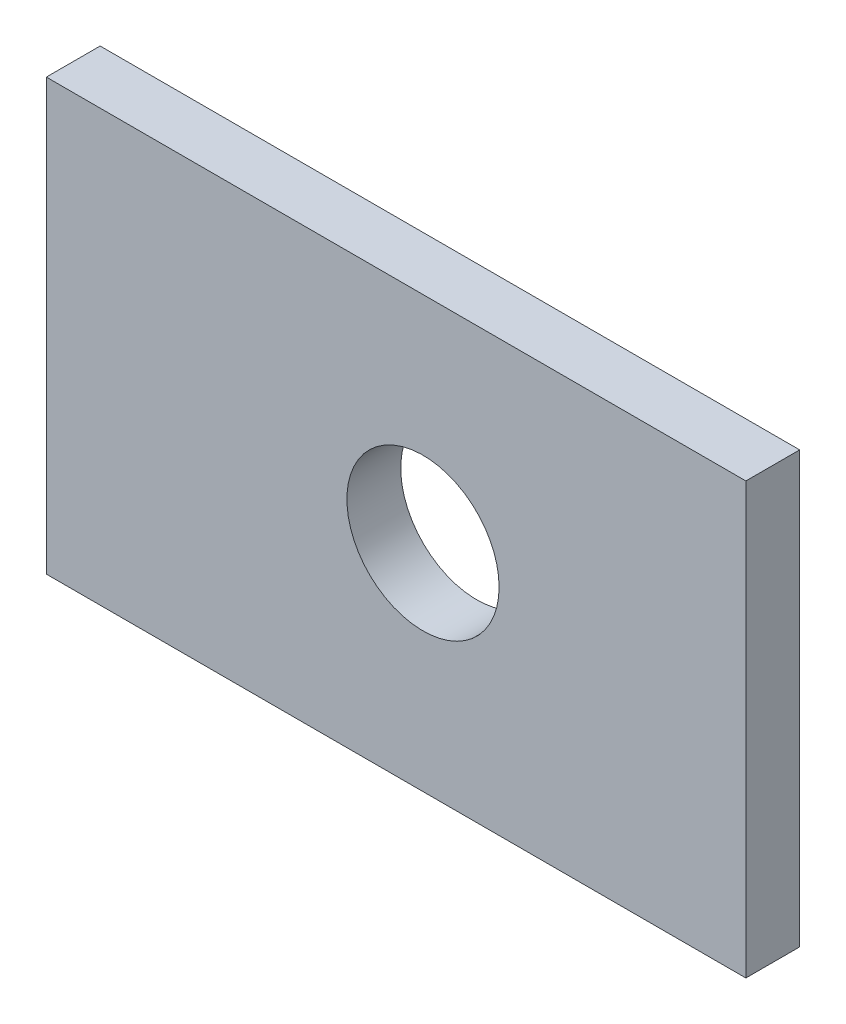
ISO-10303-21;
HEADER;
FILE_DESCRIPTION(('STEP AP214'),'2;1');
FILE_NAME('part.step','',(''),(''),'','','');
FILE_SCHEMA(('AUTOMOTIVE_DESIGN { 1 0 10303 214 1 1 1 1 }'));
ENDSEC;
DATA;
#1=APPLICATION_CONTEXT('core data for automotive mechanical design processes');
#2=APPLICATION_PROTOCOL_DEFINITION('international standard','automotive_design',2000,#1);
#3=PRODUCT_CONTEXT('',#1,'mechanical');
#4=PRODUCT('Part','Part','',(#3));
#5=PRODUCT_RELATED_PRODUCT_CATEGORY('part','',(#4));
#6=PRODUCT_DEFINITION_FORMATION('','',#4);
#7=PRODUCT_DEFINITION_CONTEXT('part definition',#1,'design');
#8=PRODUCT_DEFINITION('design','',#6,#7);
#9=PRODUCT_DEFINITION_SHAPE('','',#8);
#10=(LENGTH_UNIT() NAMED_UNIT(*) SI_UNIT(.MILLI.,.METRE.));
#11=(NAMED_UNIT(*) PLANE_ANGLE_UNIT() SI_UNIT($,.RADIAN.));
#12=(NAMED_UNIT(*) SI_UNIT($,.STERADIAN.) SOLID_ANGLE_UNIT());
#13=UNCERTAINTY_MEASURE_WITH_UNIT(LENGTH_MEASURE(1.E-05),#10,'distance_accuracy_value','');
#14=(GEOMETRIC_REPRESENTATION_CONTEXT(3) GLOBAL_UNCERTAINTY_ASSIGNED_CONTEXT((#13)) GLOBAL_UNIT_ASSIGNED_CONTEXT((#10,
#11,#12)) REPRESENTATION_CONTEXT('',''));
#15=CARTESIAN_POINT('',(0.,0.,0.));
#16=DIRECTION('',(0.,0.,1.));
#17=DIRECTION('',(1.,0.,0.));
#18=AXIS2_PLACEMENT_3D('',#15,#16,#17);
#19=CARTESIAN_POINT('',(0.,0.,10.));
#20=DIRECTION('',(0.,0.,1.));
#21=DIRECTION('',(1.,0.,0.));
#22=AXIS2_PLACEMENT_3D('',#19,#20,#21);
#23=PLANE('',#22);
#24=DIRECTION('',(0.,-1.,0.));
#25=VECTOR('',#24,1.);
#26=CARTESIAN_POINT('',(-50.,30.,10.));
#27=LINE('',#26,#25);
#28=CARTESIAN_POINT('',(-50.,30.,10.));
#29=VERTEX_POINT('',#28);
#30=CARTESIAN_POINT('',(-50.,-50.,10.));
#31=VERTEX_POINT('',#30);
#32=EDGE_CURVE('E84',#29,#31,#27,.T.);
#33=ORIENTED_EDGE('',*,*,#32,.T.);
#34=DIRECTION('',(1.,0.,0.));
#35=VECTOR('',#34,1.);
#36=CARTESIAN_POINT('',(-50.,-50.,10.));
#37=LINE('',#36,#35);
#38=CARTESIAN_POINT('',(80.,-50.,10.));
#39=VERTEX_POINT('',#38);
#40=EDGE_CURVE('E79',#31,#39,#37,.T.);
#41=ORIENTED_EDGE('',*,*,#40,.T.);
#42=DIRECTION('',(0.,1.,0.));
#43=VECTOR('',#42,1.);
#44=CARTESIAN_POINT('',(80.,30.,10.));
#45=LINE('',#44,#43);
#46=CARTESIAN_POINT('',(80.,30.,10.));
#47=VERTEX_POINT('',#46);
#48=EDGE_CURVE('E82',#39,#47,#45,.T.);
#49=ORIENTED_EDGE('',*,*,#48,.T.);
#50=DIRECTION('',(-1.,0.,0.));
#51=VECTOR('',#50,1.);
#52=CARTESIAN_POINT('',(-50.,30.,10.));
#53=LINE('',#52,#51);
#54=EDGE_CURVE('E49',#47,#29,#53,.T.);
#55=ORIENTED_EDGE('',*,*,#54,.T.);
#56=EDGE_LOOP('',(#33,#41,#49,#55));
#57=FACE_BOUND('',#56,.T.);
#58=CARTESIAN_POINT('',(20.,-10.,10.));
#59=DIRECTION('',(0.,0.,1.));
#60=DIRECTION('',(1.,0.,0.));
#61=AXIS2_PLACEMENT_3D('',#58,#59,#60);
#62=CIRCLE('',#61,14.1421356237309);
#63=CARTESIAN_POINT('',(34.1421356237309,-10.,10.));
#64=VERTEX_POINT('',#63);
#65=EDGE_CURVE('E99',#64,#64,#62,.T.);
#66=ORIENTED_EDGE('',*,*,#65,.F.);
#67=EDGE_LOOP('',(#66));
#68=FACE_BOUND('',#67,.T.);
#69=ADVANCED_FACE('F32',(#57,#68),#23,.T.);
#70=CARTESIAN_POINT('',(0.,0.,0.));
#71=DIRECTION('',(0.,0.,1.));
#72=DIRECTION('',(1.,0.,0.));
#73=AXIS2_PLACEMENT_3D('',#70,#71,#72);
#74=PLANE('',#73);
#75=DIRECTION('',(0.,-1.,0.));
#76=VECTOR('',#75,1.);
#77=CARTESIAN_POINT('',(-50.,30.,0.));
#78=LINE('',#77,#76);
#79=CARTESIAN_POINT('',(-50.,30.,0.));
#80=VERTEX_POINT('',#79);
#81=CARTESIAN_POINT('',(-50.,-50.,0.));
#82=VERTEX_POINT('',#81);
#83=EDGE_CURVE('E96',#80,#82,#78,.T.);
#84=ORIENTED_EDGE('',*,*,#83,.F.);
#85=DIRECTION('',(-1.,0.,0.));
#86=VECTOR('',#85,1.);
#87=CARTESIAN_POINT('',(-50.,30.,0.));
#88=LINE('',#87,#86);
#89=CARTESIAN_POINT('',(80.,30.,0.));
#90=VERTEX_POINT('',#89);
#91=EDGE_CURVE('E72',#90,#80,#88,.T.);
#92=ORIENTED_EDGE('',*,*,#91,.F.);
#93=DIRECTION('',(0.,1.,0.));
#94=VECTOR('',#93,1.);
#95=CARTESIAN_POINT('',(80.,30.,0.));
#96=LINE('',#95,#94);
#97=CARTESIAN_POINT('',(80.,-50.,0.));
#98=VERTEX_POINT('',#97);
#99=EDGE_CURVE('E66',#98,#90,#96,.T.);
#100=ORIENTED_EDGE('',*,*,#99,.F.);
#101=DIRECTION('',(1.,0.,0.));
#102=VECTOR('',#101,1.);
#103=CARTESIAN_POINT('',(-50.,-50.,0.));
#104=LINE('',#103,#102);
#105=EDGE_CURVE('E88',#82,#98,#104,.T.);
#106=ORIENTED_EDGE('',*,*,#105,.F.);
#107=EDGE_LOOP('',(#84,#92,#100,#106));
#108=FACE_BOUND('',#107,.T.);
#109=CARTESIAN_POINT('',(20.,-10.,0.));
#110=DIRECTION('',(0.,0.,1.));
#111=DIRECTION('',(1.,0.,0.));
#112=AXIS2_PLACEMENT_3D('',#109,#110,#111);
#113=CIRCLE('',#112,14.1421356237309);
#114=CARTESIAN_POINT('',(34.1421356237309,-10.,0.));
#115=VERTEX_POINT('',#114);
#116=EDGE_CURVE('E111',#115,#115,#113,.T.);
#117=ORIENTED_EDGE('',*,*,#116,.T.);
#118=EDGE_LOOP('',(#117));
#119=FACE_BOUND('',#118,.T.);
#120=ADVANCED_FACE('F107',(#108,#119),#74,.F.);
#121=CARTESIAN_POINT('',(-50.,30.,10.));
#122=DIRECTION('',(1.,0.,0.));
#123=DIRECTION('',(0.,0.,-1.));
#124=AXIS2_PLACEMENT_3D('',#121,#122,#123);
#125=PLANE('',#124);
#126=ORIENTED_EDGE('',*,*,#83,.T.);
#127=DIRECTION('',(0.,0.,-1.));
#128=VECTOR('',#127,1.);
#129=CARTESIAN_POINT('',(-50.,-50.,10.));
#130=LINE('',#129,#128);
#131=EDGE_CURVE('E11',#31,#82,#130,.T.);
#132=ORIENTED_EDGE('',*,*,#131,.F.);
#133=ORIENTED_EDGE('',*,*,#32,.F.);
#134=DIRECTION('',(0.,0.,-1.));
#135=VECTOR('',#134,1.);
#136=CARTESIAN_POINT('',(-50.,30.,10.));
#137=LINE('',#136,#135);
#138=EDGE_CURVE('E92',#29,#80,#137,.T.);
#139=ORIENTED_EDGE('',*,*,#138,.T.);
#140=EDGE_LOOP('',(#126,#132,#133,#139));
#141=FACE_BOUND('',#140,.T.);
#142=ADVANCED_FACE('F34',(#141),#125,.F.);
#143=CARTESIAN_POINT('',(-50.,-50.,10.));
#144=DIRECTION('',(0.,1.,0.));
#145=DIRECTION('',(0.,0.,1.));
#146=AXIS2_PLACEMENT_3D('',#143,#144,#145);
#147=PLANE('',#146);
#148=ORIENTED_EDGE('',*,*,#105,.T.);
#149=DIRECTION('',(0.,0.,-1.));
#150=VECTOR('',#149,1.);
#151=CARTESIAN_POINT('',(80.,-50.,10.));
#152=LINE('',#151,#150);
#153=EDGE_CURVE('E41',#39,#98,#152,.T.);
#154=ORIENTED_EDGE('',*,*,#153,.F.);
#155=ORIENTED_EDGE('',*,*,#40,.F.);
#156=ORIENTED_EDGE('',*,*,#131,.T.);
#157=EDGE_LOOP('',(#148,#154,#155,#156));
#158=FACE_BOUND('',#157,.T.);
#159=ADVANCED_FACE('F87',(#158),#147,.F.);
#160=CARTESIAN_POINT('',(80.,30.,10.));
#161=DIRECTION('',(-1.,0.,0.));
#162=DIRECTION('',(0.,0.,1.));
#163=AXIS2_PLACEMENT_3D('',#160,#161,#162);
#164=PLANE('',#163);
#165=ORIENTED_EDGE('',*,*,#99,.T.);
#166=DIRECTION('',(0.,0.,-1.));
#167=VECTOR('',#166,1.);
#168=CARTESIAN_POINT('',(80.,30.,10.));
#169=LINE('',#168,#167);
#170=EDGE_CURVE('E89',#47,#90,#169,.T.);
#171=ORIENTED_EDGE('',*,*,#170,.F.);
#172=ORIENTED_EDGE('',*,*,#48,.F.);
#173=ORIENTED_EDGE('',*,*,#153,.T.);
#174=EDGE_LOOP('',(#165,#171,#172,#173));
#175=FACE_BOUND('',#174,.T.);
#176=ADVANCED_FACE('F90',(#175),#164,.F.);
#177=CARTESIAN_POINT('',(-50.,30.,10.));
#178=DIRECTION('',(0.,-1.,0.));
#179=DIRECTION('',(0.,0.,-1.));
#180=AXIS2_PLACEMENT_3D('',#177,#178,#179);
#181=PLANE('',#180);
#182=ORIENTED_EDGE('',*,*,#91,.T.);
#183=ORIENTED_EDGE('',*,*,#138,.F.);
#184=ORIENTED_EDGE('',*,*,#54,.F.);
#185=ORIENTED_EDGE('',*,*,#170,.T.);
#186=EDGE_LOOP('',(#182,#183,#184,#185));
#187=FACE_BOUND('',#186,.T.);
#188=ADVANCED_FACE('F104',(#187),#181,.F.);
#189=CARTESIAN_POINT('',(20.,-10.,10.));
#190=DIRECTION('',(0.,0.,-1.));
#191=DIRECTION('',(-1.,0.,0.));
#192=AXIS2_PLACEMENT_3D('',#189,#190,#191);
#193=CYLINDRICAL_SURFACE('',#192,14.1421356237309);
#194=ORIENTED_EDGE('',*,*,#65,.T.);
#195=EDGE_LOOP('',(#194));
#196=FACE_BOUND('',#195,.T.);
#197=ORIENTED_EDGE('',*,*,#116,.F.);
#198=EDGE_LOOP('',(#197));
#199=FACE_BOUND('',#198,.T.);
#200=ADVANCED_FACE('F117',(#196,#199),#193,.F.);
#201=CLOSED_SHELL('',(#69,#120,#142,#159,#176,#188,#200));
#202=MANIFOLD_SOLID_BREP('B2',#201);
#203=ADVANCED_BREP_SHAPE_REPRESENTATION('',(#18,#202),#14);
#204=SHAPE_DEFINITION_REPRESENTATION(#9,#203);
ENDSEC;
END-ISO-10303-21;
